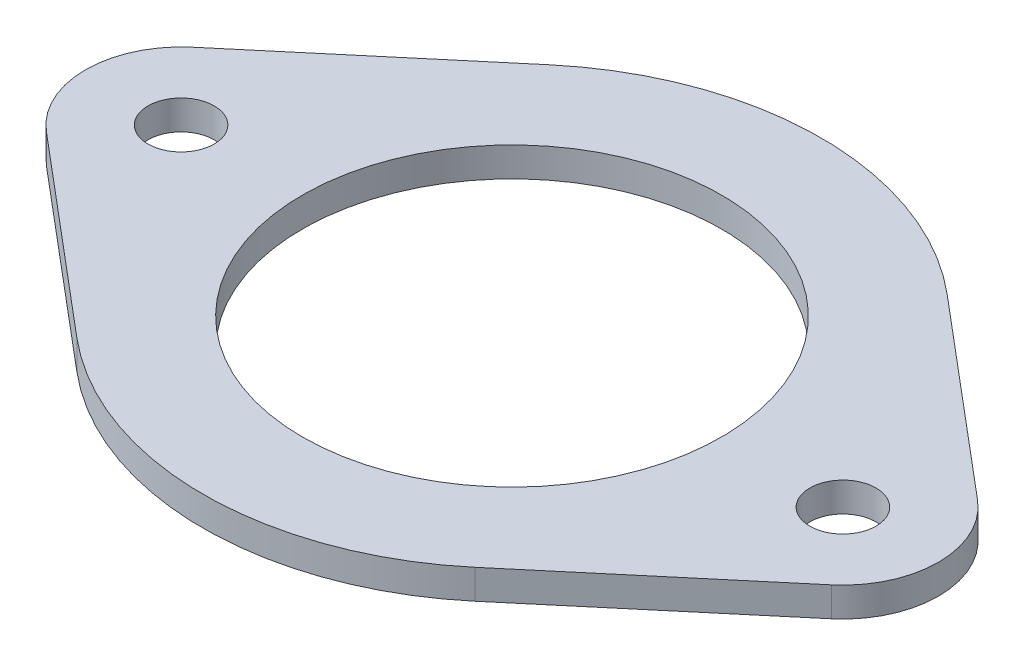
ISO-10303-21;
HEADER;
FILE_DESCRIPTION(('STEP AP214'),'2;1');
FILE_NAME('part.step','',(''),(''),'','','');
FILE_SCHEMA(('AUTOMOTIVE_DESIGN { 1 0 10303 214 1 1 1 1 }'));
ENDSEC;
DATA;
#1=APPLICATION_CONTEXT('core data for automotive mechanical design processes');
#2=APPLICATION_PROTOCOL_DEFINITION('international standard','automotive_design',2000,#1);
#3=PRODUCT_CONTEXT('',#1,'mechanical');
#4=PRODUCT('Part','Part','',(#3));
#5=PRODUCT_RELATED_PRODUCT_CATEGORY('part','',(#4));
#6=PRODUCT_DEFINITION_FORMATION('','',#4);
#7=PRODUCT_DEFINITION_CONTEXT('part definition',#1,'design');
#8=PRODUCT_DEFINITION('design','',#6,#7);
#9=PRODUCT_DEFINITION_SHAPE('','',#8);
#10=(LENGTH_UNIT() NAMED_UNIT(*) SI_UNIT(.MILLI.,.METRE.));
#11=(NAMED_UNIT(*) PLANE_ANGLE_UNIT() SI_UNIT($,.RADIAN.));
#12=(NAMED_UNIT(*) SI_UNIT($,.STERADIAN.) SOLID_ANGLE_UNIT());
#13=UNCERTAINTY_MEASURE_WITH_UNIT(LENGTH_MEASURE(1.E-05),#10,'distance_accuracy_value','');
#14=(GEOMETRIC_REPRESENTATION_CONTEXT(3) GLOBAL_UNCERTAINTY_ASSIGNED_CONTEXT((#13)) GLOBAL_UNIT_ASSIGNED_CONTEXT((#10,
#11,#12)) REPRESENTATION_CONTEXT('',''));
#15=CARTESIAN_POINT('',(0.,0.,0.));
#16=DIRECTION('',(0.,0.,1.));
#17=DIRECTION('',(1.,0.,0.));
#18=AXIS2_PLACEMENT_3D('',#15,#16,#17);
#19=CARTESIAN_POINT('',(0.,2.,0.));
#20=DIRECTION('',(0.,1.,0.));
#21=DIRECTION('',(0.,0.,1.));
#22=AXIS2_PLACEMENT_3D('',#19,#20,#21);
#23=PLANE('',#22);
#24=CARTESIAN_POINT('',(22.5,2.,0.));
#25=DIRECTION('',(0.,1.,0.));
#26=DIRECTION('',(0.,0.,1.));
#27=AXIS2_PLACEMENT_3D('',#24,#25,#26);
#28=CIRCLE('',#27,2.25);
#29=CARTESIAN_POINT('',(22.5,2.,2.25));
#30=VERTEX_POINT('',#29);
#31=EDGE_CURVE('E547',#30,#30,#28,.T.);
#32=ORIENTED_EDGE('',*,*,#31,.F.);
#33=EDGE_LOOP('',(#32));
#34=FACE_BOUND('',#33,.T.);
#35=CARTESIAN_POINT('',(0.,2.,0.));
#36=DIRECTION('',(0.,1.,0.));
#37=DIRECTION('',(0.,0.,1.));
#38=AXIS2_PLACEMENT_3D('',#35,#36,#37);
#39=CIRCLE('',#38,21.);
#40=CARTESIAN_POINT('',(13.5333333333333,2.,-16.0576738318129));
#41=VERTEX_POINT('',#40);
#42=CARTESIAN_POINT('',(-13.5333333333333,2.,-16.0576738318129));
#43=VERTEX_POINT('',#42);
#44=EDGE_CURVE('E452',#41,#43,#39,.T.);
#45=ORIENTED_EDGE('',*,*,#44,.T.);
#46=DIRECTION('',(-0.764651134848233,0.,0.644444444444444));
#47=VECTOR('',#46,1.);
#48=CARTESIAN_POINT('',(-26.6888888888889,2.,-4.97023237651352));
#49=LINE('',#48,#47);
#50=CARTESIAN_POINT('',(-26.6888888888889,2.,-4.97023237651352));
#51=VERTEX_POINT('',#50);
#52=EDGE_CURVE('E429',#43,#51,#49,.T.);
#53=ORIENTED_EDGE('',*,*,#52,.T.);
#54=CARTESIAN_POINT('',(-22.5,2.,0.));
#55=DIRECTION('',(0.,1.,0.));
#56=DIRECTION('',(0.,0.,1.));
#57=AXIS2_PLACEMENT_3D('',#54,#55,#56);
#58=CIRCLE('',#57,6.5);
#59=CARTESIAN_POINT('',(-26.6888888888889,2.,4.97023237651351));
#60=VERTEX_POINT('',#59);
#61=EDGE_CURVE('E455',#51,#60,#58,.T.);
#62=ORIENTED_EDGE('',*,*,#61,.T.);
#63=DIRECTION('',(0.764651134848233,0.,0.644444444444445));
#64=VECTOR('',#63,1.);
#65=CARTESIAN_POINT('',(-26.6888888888889,2.,4.97023237651351));
#66=LINE('',#65,#64);
#67=CARTESIAN_POINT('',(-13.5333333333333,2.,16.0576738318129));
#68=VERTEX_POINT('',#67);
#69=EDGE_CURVE('E457',#60,#68,#66,.T.);
#70=ORIENTED_EDGE('',*,*,#69,.T.);
#71=CARTESIAN_POINT('',(0.,2.,0.));
#72=DIRECTION('',(0.,1.,0.));
#73=DIRECTION('',(0.,0.,1.));
#74=AXIS2_PLACEMENT_3D('',#71,#72,#73);
#75=CIRCLE('',#74,21.);
#76=CARTESIAN_POINT('',(13.5333333333333,2.,16.0576738318129));
#77=VERTEX_POINT('',#76);
#78=EDGE_CURVE('E459',#68,#77,#75,.T.);
#79=ORIENTED_EDGE('',*,*,#78,.T.);
#80=DIRECTION('',(0.764651134848234,0.,-0.644444444444445));
#81=VECTOR('',#80,1.);
#82=CARTESIAN_POINT('',(13.5333333333333,2.,16.0576738318129));
#83=LINE('',#82,#81);
#84=CARTESIAN_POINT('',(26.6888888888889,2.,4.97023237651351));
#85=VERTEX_POINT('',#84);
#86=EDGE_CURVE('E461',#77,#85,#83,.T.);
#87=ORIENTED_EDGE('',*,*,#86,.T.);
#88=CARTESIAN_POINT('',(22.5,2.,0.));
#89=DIRECTION('',(0.,1.,0.));
#90=DIRECTION('',(0.,0.,1.));
#91=AXIS2_PLACEMENT_3D('',#88,#89,#90);
#92=CIRCLE('',#91,6.5);
#93=CARTESIAN_POINT('',(26.6888888888889,2.,-4.97023237651351));
#94=VERTEX_POINT('',#93);
#95=EDGE_CURVE('E370',#85,#94,#92,.T.);
#96=ORIENTED_EDGE('',*,*,#95,.T.);
#97=DIRECTION('',(-0.764651134848233,0.,-0.644444444444445));
#98=VECTOR('',#97,1.);
#99=CARTESIAN_POINT('',(13.5333333333333,2.,-16.0576738318129));
#100=LINE('',#99,#98);
#101=EDGE_CURVE('E365',#94,#41,#100,.T.);
#102=ORIENTED_EDGE('',*,*,#101,.T.);
#103=EDGE_LOOP('',(#45,#53,#62,#70,#79,#87,#96,#102));
#104=FACE_BOUND('',#103,.T.);
#105=CARTESIAN_POINT('',(0.,2.,0.));
#106=DIRECTION('',(0.,1.,0.));
#107=DIRECTION('',(0.,0.,1.));
#108=AXIS2_PLACEMENT_3D('',#105,#106,#107);
#109=CIRCLE('',#108,14.25);
#110=CARTESIAN_POINT('',(0.,2.,14.25));
#111=VERTEX_POINT('',#110);
#112=EDGE_CURVE('E434',#111,#111,#109,.T.);
#113=ORIENTED_EDGE('',*,*,#112,.F.);
#114=EDGE_LOOP('',(#113));
#115=FACE_BOUND('',#114,.T.);
#116=CARTESIAN_POINT('',(-22.5,2.,0.));
#117=DIRECTION('',(0.,1.,0.));
#118=DIRECTION('',(0.,0.,1.));
#119=AXIS2_PLACEMENT_3D('',#116,#117,#118);
#120=CIRCLE('',#119,2.25);
#121=CARTESIAN_POINT('',(-22.5,2.,2.25));
#122=VERTEX_POINT('',#121);
#123=EDGE_CURVE('E536',#122,#122,#120,.T.);
#124=ORIENTED_EDGE('',*,*,#123,.F.);
#125=EDGE_LOOP('',(#124));
#126=FACE_BOUND('',#125,.T.);
#127=ADVANCED_FACE('F350',(#34,#104,#115,#126),#23,.T.);
#128=CARTESIAN_POINT('',(0.,0.,0.));
#129=DIRECTION('',(0.,1.,0.));
#130=DIRECTION('',(0.,0.,1.));
#131=AXIS2_PLACEMENT_3D('',#128,#129,#130);
#132=PLANE('',#131);
#133=CARTESIAN_POINT('',(22.5,0.,0.));
#134=DIRECTION('',(0.,1.,0.));
#135=DIRECTION('',(0.,0.,1.));
#136=AXIS2_PLACEMENT_3D('',#133,#134,#135);
#137=CIRCLE('',#136,2.25);
#138=CARTESIAN_POINT('',(22.5,0.,2.25));
#139=VERTEX_POINT('',#138);
#140=EDGE_CURVE('E542',#139,#139,#137,.T.);
#141=ORIENTED_EDGE('',*,*,#140,.T.);
#142=EDGE_LOOP('',(#141));
#143=FACE_BOUND('',#142,.T.);
#144=CARTESIAN_POINT('',(0.,0.,0.));
#145=DIRECTION('',(0.,1.,0.));
#146=DIRECTION('',(0.,0.,1.));
#147=AXIS2_PLACEMENT_3D('',#144,#145,#146);
#148=CIRCLE('',#147,21.);
#149=CARTESIAN_POINT('',(13.5333333333333,0.,-16.0576738318129));
#150=VERTEX_POINT('',#149);
#151=CARTESIAN_POINT('',(-13.5333333333333,0.,-16.0576738318129));
#152=VERTEX_POINT('',#151);
#153=EDGE_CURVE('E420',#150,#152,#148,.T.);
#154=ORIENTED_EDGE('',*,*,#153,.F.);
#155=DIRECTION('',(-0.764651134848233,0.,-0.644444444444445));
#156=VECTOR('',#155,1.);
#157=CARTESIAN_POINT('',(13.5333333333333,0.,-16.0576738318129));
#158=LINE('',#157,#156);
#159=CARTESIAN_POINT('',(26.6888888888889,0.,-4.97023237651351));
#160=VERTEX_POINT('',#159);
#161=EDGE_CURVE('E450',#160,#150,#158,.T.);
#162=ORIENTED_EDGE('',*,*,#161,.F.);
#163=CARTESIAN_POINT('',(22.5,0.,0.));
#164=DIRECTION('',(0.,1.,0.));
#165=DIRECTION('',(0.,0.,1.));
#166=AXIS2_PLACEMENT_3D('',#163,#164,#165);
#167=CIRCLE('',#166,6.5);
#168=CARTESIAN_POINT('',(26.6888888888889,0.,4.97023237651351));
#169=VERTEX_POINT('',#168);
#170=EDGE_CURVE('E448',#169,#160,#167,.T.);
#171=ORIENTED_EDGE('',*,*,#170,.F.);
#172=DIRECTION('',(0.764651134848234,0.,-0.644444444444445));
#173=VECTOR('',#172,1.);
#174=CARTESIAN_POINT('',(13.5333333333333,0.,16.0576738318129));
#175=LINE('',#174,#173);
#176=CARTESIAN_POINT('',(13.5333333333333,0.,16.0576738318129));
#177=VERTEX_POINT('',#176);
#178=EDGE_CURVE('E446',#177,#169,#175,.T.);
#179=ORIENTED_EDGE('',*,*,#178,.F.);
#180=CARTESIAN_POINT('',(0.,0.,0.));
#181=DIRECTION('',(0.,1.,0.));
#182=DIRECTION('',(0.,0.,1.));
#183=AXIS2_PLACEMENT_3D('',#180,#181,#182);
#184=CIRCLE('',#183,21.);
#185=CARTESIAN_POINT('',(-13.5333333333333,0.,16.0576738318129));
#186=VERTEX_POINT('',#185);
#187=EDGE_CURVE('E444',#186,#177,#184,.T.);
#188=ORIENTED_EDGE('',*,*,#187,.F.);
#189=DIRECTION('',(0.764651134848233,0.,0.644444444444445));
#190=VECTOR('',#189,1.);
#191=CARTESIAN_POINT('',(-26.6888888888889,0.,4.97023237651351));
#192=LINE('',#191,#190);
#193=CARTESIAN_POINT('',(-26.6888888888889,0.,4.97023237651351));
#194=VERTEX_POINT('',#193);
#195=EDGE_CURVE('E442',#194,#186,#192,.T.);
#196=ORIENTED_EDGE('',*,*,#195,.F.);
#197=CARTESIAN_POINT('',(-22.5,0.,0.));
#198=DIRECTION('',(0.,1.,0.));
#199=DIRECTION('',(0.,0.,1.));
#200=AXIS2_PLACEMENT_3D('',#197,#198,#199);
#201=CIRCLE('',#200,6.5);
#202=CARTESIAN_POINT('',(-26.6888888888889,0.,-4.97023237651352));
#203=VERTEX_POINT('',#202);
#204=EDGE_CURVE('E422',#203,#194,#201,.T.);
#205=ORIENTED_EDGE('',*,*,#204,.F.);
#206=DIRECTION('',(-0.764651134848233,0.,0.644444444444444));
#207=VECTOR('',#206,1.);
#208=CARTESIAN_POINT('',(-26.6888888888889,0.,-4.97023237651352));
#209=LINE('',#208,#207);
#210=EDGE_CURVE('E415',#152,#203,#209,.T.);
#211=ORIENTED_EDGE('',*,*,#210,.F.);
#212=EDGE_LOOP('',(#154,#162,#171,#179,#188,#196,#205,#211));
#213=FACE_BOUND('',#212,.T.);
#214=CARTESIAN_POINT('',(0.,0.,0.));
#215=DIRECTION('',(0.,1.,0.));
#216=DIRECTION('',(0.,0.,1.));
#217=AXIS2_PLACEMENT_3D('',#214,#215,#216);
#218=CIRCLE('',#217,14.25);
#219=CARTESIAN_POINT('',(0.,0.,14.25));
#220=VERTEX_POINT('',#219);
#221=EDGE_CURVE('E437',#220,#220,#218,.T.);
#222=ORIENTED_EDGE('',*,*,#221,.T.);
#223=EDGE_LOOP('',(#222));
#224=FACE_BOUND('',#223,.T.);
#225=CARTESIAN_POINT('',(-22.5,0.,0.));
#226=DIRECTION('',(0.,1.,0.));
#227=DIRECTION('',(0.,0.,1.));
#228=AXIS2_PLACEMENT_3D('',#225,#226,#227);
#229=CIRCLE('',#228,2.25);
#230=CARTESIAN_POINT('',(-22.5,0.,2.25));
#231=VERTEX_POINT('',#230);
#232=EDGE_CURVE('E539',#231,#231,#229,.T.);
#233=ORIENTED_EDGE('',*,*,#232,.T.);
#234=EDGE_LOOP('',(#233));
#235=FACE_BOUND('',#234,.T.);
#236=ADVANCED_FACE('F416',(#143,#213,#224,#235),#132,.F.);
#237=CARTESIAN_POINT('',(0.,2.,0.));
#238=DIRECTION('',(0.,-1.,0.));
#239=DIRECTION('',(0.,0.,-1.));
#240=AXIS2_PLACEMENT_3D('',#237,#238,#239);
#241=CYLINDRICAL_SURFACE('',#240,21.);
#242=ORIENTED_EDGE('',*,*,#153,.T.);
#243=DIRECTION('',(0.,-1.,0.));
#244=VECTOR('',#243,1.);
#245=CARTESIAN_POINT('',(-13.5333333333333,2.,-16.0576738318129));
#246=LINE('',#245,#244);
#247=EDGE_CURVE('E11',#43,#152,#246,.T.);
#248=ORIENTED_EDGE('',*,*,#247,.F.);
#249=ORIENTED_EDGE('',*,*,#44,.F.);
#250=DIRECTION('',(0.,-1.,0.));
#251=VECTOR('',#250,1.);
#252=CARTESIAN_POINT('',(13.5333333333333,2.,-16.0576738318129));
#253=LINE('',#252,#251);
#254=EDGE_CURVE('E433',#41,#150,#253,.T.);
#255=ORIENTED_EDGE('',*,*,#254,.T.);
#256=EDGE_LOOP('',(#242,#248,#249,#255));
#257=FACE_BOUND('',#256,.T.);
#258=ADVANCED_FACE('F352',(#257),#241,.T.);
#259=CARTESIAN_POINT('',(-26.6888888888889,2.,-4.97023237651352));
#260=DIRECTION('',(0.644444444444444,0.,0.764651134848233));
#261=DIRECTION('',(0.764651134848233,0.,-0.644444444444444));
#262=AXIS2_PLACEMENT_3D('',#259,#260,#261);
#263=PLANE('',#262);
#264=ORIENTED_EDGE('',*,*,#210,.T.);
#265=DIRECTION('',(0.,-1.,0.));
#266=VECTOR('',#265,1.);
#267=CARTESIAN_POINT('',(-26.6888888888889,2.,-4.97023237651352));
#268=LINE('',#267,#266);
#269=EDGE_CURVE('E358',#51,#203,#268,.T.);
#270=ORIENTED_EDGE('',*,*,#269,.F.);
#271=ORIENTED_EDGE('',*,*,#52,.F.);
#272=ORIENTED_EDGE('',*,*,#247,.T.);
#273=EDGE_LOOP('',(#264,#270,#271,#272));
#274=FACE_BOUND('',#273,.T.);
#275=ADVANCED_FACE('F428',(#274),#263,.F.);
#276=CARTESIAN_POINT('',(-22.5,2.,0.));
#277=DIRECTION('',(0.,-1.,0.));
#278=DIRECTION('',(0.,0.,-1.));
#279=AXIS2_PLACEMENT_3D('',#276,#277,#278);
#280=CYLINDRICAL_SURFACE('',#279,6.5);
#281=ORIENTED_EDGE('',*,*,#204,.T.);
#282=DIRECTION('',(0.,-1.,0.));
#283=VECTOR('',#282,1.);
#284=CARTESIAN_POINT('',(-26.6888888888889,2.,4.97023237651351));
#285=LINE('',#284,#283);
#286=EDGE_CURVE('E478',#60,#194,#285,.T.);
#287=ORIENTED_EDGE('',*,*,#286,.F.);
#288=ORIENTED_EDGE('',*,*,#61,.F.);
#289=ORIENTED_EDGE('',*,*,#269,.T.);
#290=EDGE_LOOP('',(#281,#287,#288,#289));
#291=FACE_BOUND('',#290,.T.);
#292=ADVANCED_FACE('F482',(#291),#280,.T.);
#293=CARTESIAN_POINT('',(-26.6888888888889,2.,4.97023237651351));
#294=DIRECTION('',(0.644444444444445,0.,-0.764651134848233));
#295=DIRECTION('',(-0.764651134848233,0.,-0.644444444444445));
#296=AXIS2_PLACEMENT_3D('',#293,#294,#295);
#297=PLANE('',#296);
#298=ORIENTED_EDGE('',*,*,#195,.T.);
#299=DIRECTION('',(0.,-1.,0.));
#300=VECTOR('',#299,1.);
#301=CARTESIAN_POINT('',(-13.5333333333333,2.,16.0576738318129));
#302=LINE('',#301,#300);
#303=EDGE_CURVE('E475',#68,#186,#302,.T.);
#304=ORIENTED_EDGE('',*,*,#303,.F.);
#305=ORIENTED_EDGE('',*,*,#69,.F.);
#306=ORIENTED_EDGE('',*,*,#286,.T.);
#307=EDGE_LOOP('',(#298,#304,#305,#306));
#308=FACE_BOUND('',#307,.T.);
#309=ADVANCED_FACE('F490',(#308),#297,.F.);
#310=CARTESIAN_POINT('',(0.,2.,0.));
#311=DIRECTION('',(0.,-1.,0.));
#312=DIRECTION('',(0.,0.,-1.));
#313=AXIS2_PLACEMENT_3D('',#310,#311,#312);
#314=CYLINDRICAL_SURFACE('',#313,21.);
#315=ORIENTED_EDGE('',*,*,#187,.T.);
#316=DIRECTION('',(0.,-1.,0.));
#317=VECTOR('',#316,1.);
#318=CARTESIAN_POINT('',(13.5333333333333,2.,16.0576738318129));
#319=LINE('',#318,#317);
#320=EDGE_CURVE('E472',#77,#177,#319,.T.);
#321=ORIENTED_EDGE('',*,*,#320,.F.);
#322=ORIENTED_EDGE('',*,*,#78,.F.);
#323=ORIENTED_EDGE('',*,*,#303,.T.);
#324=EDGE_LOOP('',(#315,#321,#322,#323));
#325=FACE_BOUND('',#324,.T.);
#326=ADVANCED_FACE('F493',(#325),#314,.T.);
#327=CARTESIAN_POINT('',(13.5333333333333,2.,16.0576738318129));
#328=DIRECTION('',(-0.644444444444444,0.,-0.764651134848233));
#329=DIRECTION('',(-0.764651134848234,0.,0.644444444444444));
#330=AXIS2_PLACEMENT_3D('',#327,#328,#329);
#331=PLANE('',#330);
#332=ORIENTED_EDGE('',*,*,#178,.T.);
#333=DIRECTION('',(0.,-1.,0.));
#334=VECTOR('',#333,1.);
#335=CARTESIAN_POINT('',(26.6888888888889,2.,4.97023237651351));
#336=LINE('',#335,#334);
#337=EDGE_CURVE('E469',#85,#169,#336,.T.);
#338=ORIENTED_EDGE('',*,*,#337,.F.);
#339=ORIENTED_EDGE('',*,*,#86,.F.);
#340=ORIENTED_EDGE('',*,*,#320,.T.);
#341=EDGE_LOOP('',(#332,#338,#339,#340));
#342=FACE_BOUND('',#341,.T.);
#343=ADVANCED_FACE('F498',(#342),#331,.F.);
#344=CARTESIAN_POINT('',(22.5,2.,0.));
#345=DIRECTION('',(0.,-1.,0.));
#346=DIRECTION('',(0.,0.,-1.));
#347=AXIS2_PLACEMENT_3D('',#344,#345,#346);
#348=CYLINDRICAL_SURFACE('',#347,6.5);
#349=ORIENTED_EDGE('',*,*,#170,.T.);
#350=DIRECTION('',(0.,-1.,0.));
#351=VECTOR('',#350,1.);
#352=CARTESIAN_POINT('',(26.6888888888889,2.,-4.97023237651351));
#353=LINE('',#352,#351);
#354=EDGE_CURVE('E466',#94,#160,#353,.T.);
#355=ORIENTED_EDGE('',*,*,#354,.F.);
#356=ORIENTED_EDGE('',*,*,#95,.F.);
#357=ORIENTED_EDGE('',*,*,#337,.T.);
#358=EDGE_LOOP('',(#349,#355,#356,#357));
#359=FACE_BOUND('',#358,.T.);
#360=ADVANCED_FACE('F501',(#359),#348,.T.);
#361=CARTESIAN_POINT('',(13.5333333333333,2.,-16.0576738318129));
#362=DIRECTION('',(-0.644444444444445,0.,0.764651134848233));
#363=DIRECTION('',(0.764651134848233,0.,0.644444444444445));
#364=AXIS2_PLACEMENT_3D('',#361,#362,#363);
#365=PLANE('',#364);
#366=ORIENTED_EDGE('',*,*,#161,.T.);
#367=ORIENTED_EDGE('',*,*,#254,.F.);
#368=ORIENTED_EDGE('',*,*,#101,.F.);
#369=ORIENTED_EDGE('',*,*,#354,.T.);
#370=EDGE_LOOP('',(#366,#367,#368,#369));
#371=FACE_BOUND('',#370,.T.);
#372=ADVANCED_FACE('F503',(#371),#365,.F.);
#373=CARTESIAN_POINT('',(0.,2.,0.));
#374=DIRECTION('',(0.,-1.,0.));
#375=DIRECTION('',(0.,0.,-1.));
#376=AXIS2_PLACEMENT_3D('',#373,#374,#375);
#377=CYLINDRICAL_SURFACE('',#376,14.25);
#378=ORIENTED_EDGE('',*,*,#112,.T.);
#379=EDGE_LOOP('',(#378));
#380=FACE_BOUND('',#379,.T.);
#381=ORIENTED_EDGE('',*,*,#221,.F.);
#382=EDGE_LOOP('',(#381));
#383=FACE_BOUND('',#382,.T.);
#384=ADVANCED_FACE('F505',(#380,#383),#377,.F.);
#385=CARTESIAN_POINT('',(22.5,2.,0.));
#386=DIRECTION('',(0.,-1.,0.));
#387=DIRECTION('',(0.,0.,-1.));
#388=AXIS2_PLACEMENT_3D('',#385,#386,#387);
#389=CYLINDRICAL_SURFACE('',#388,2.25);
#390=ORIENTED_EDGE('',*,*,#31,.T.);
#391=EDGE_LOOP('',(#390));
#392=FACE_BOUND('',#391,.T.);
#393=ORIENTED_EDGE('',*,*,#140,.F.);
#394=EDGE_LOOP('',(#393));
#395=FACE_BOUND('',#394,.T.);
#396=ADVANCED_FACE('F511',(#392,#395),#389,.F.);
#397=CARTESIAN_POINT('',(-22.5,2.,0.));
#398=DIRECTION('',(0.,-1.,0.));
#399=DIRECTION('',(0.,0.,-1.));
#400=AXIS2_PLACEMENT_3D('',#397,#398,#399);
#401=CYLINDRICAL_SURFACE('',#400,2.25);
#402=ORIENTED_EDGE('',*,*,#123,.T.);
#403=EDGE_LOOP('',(#402));
#404=FACE_BOUND('',#403,.T.);
#405=ORIENTED_EDGE('',*,*,#232,.F.);
#406=EDGE_LOOP('',(#405));
#407=FACE_BOUND('',#406,.T.);
#408=ADVANCED_FACE('F527',(#404,#407),#401,.F.);
#409=CLOSED_SHELL('',(#127,#236,#258,#275,#292,#309,#326,#343,#360,#372,#384,#396,#408));
#410=MANIFOLD_SOLID_BREP('B2',#409);
#411=ADVANCED_BREP_SHAPE_REPRESENTATION('',(#18,#410),#14);
#412=SHAPE_DEFINITION_REPRESENTATION(#9,#411);
ENDSEC;
END-ISO-10303-21;
